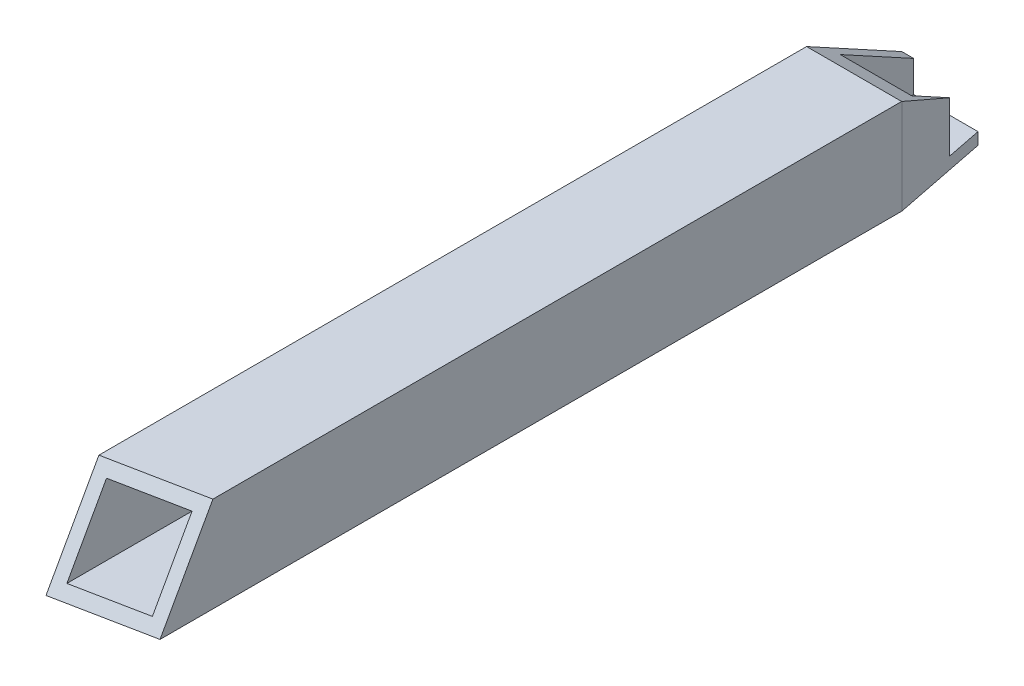
ISO-10303-21;
HEADER;
FILE_DESCRIPTION(('STEP AP214'),'2;1');
FILE_NAME('part.step','',(''),(''),'','','');
FILE_SCHEMA(('AUTOMOTIVE_DESIGN { 1 0 10303 214 1 1 1 1 }'));
ENDSEC;
DATA;
#1=APPLICATION_CONTEXT('core data for automotive mechanical design processes');
#2=APPLICATION_PROTOCOL_DEFINITION('international standard','automotive_design',2000,#1);
#3=PRODUCT_CONTEXT('',#1,'mechanical');
#4=PRODUCT('Part','Part','',(#3));
#5=PRODUCT_RELATED_PRODUCT_CATEGORY('part','',(#4));
#6=PRODUCT_DEFINITION_FORMATION('','',#4);
#7=PRODUCT_DEFINITION_CONTEXT('part definition',#1,'design');
#8=PRODUCT_DEFINITION('design','',#6,#7);
#9=PRODUCT_DEFINITION_SHAPE('','',#8);
#10=(LENGTH_UNIT() NAMED_UNIT(*) SI_UNIT(.MILLI.,.METRE.));
#11=(NAMED_UNIT(*) PLANE_ANGLE_UNIT() SI_UNIT($,.RADIAN.));
#12=(NAMED_UNIT(*) SI_UNIT($,.STERADIAN.) SOLID_ANGLE_UNIT());
#13=UNCERTAINTY_MEASURE_WITH_UNIT(LENGTH_MEASURE(1.E-05),#10,'distance_accuracy_value','');
#14=(GEOMETRIC_REPRESENTATION_CONTEXT(3) GLOBAL_UNCERTAINTY_ASSIGNED_CONTEXT((#13)) GLOBAL_UNIT_ASSIGNED_CONTEXT((#10,
#11,#12)) REPRESENTATION_CONTEXT('',''));
#15=CARTESIAN_POINT('',(0.,0.,0.));
#16=DIRECTION('',(0.,0.,1.));
#17=DIRECTION('',(1.,0.,0.));
#18=AXIS2_PLACEMENT_3D('',#15,#16,#17);
#19=CARTESIAN_POINT('',(12.7,-12.7,114.3));
#20=DIRECTION('',(-1.,0.,0.));
#21=DIRECTION('',(0.,0.,1.));
#22=AXIS2_PLACEMENT_3D('',#19,#20,#21);
#23=PLANE('',#22);
#24=DIRECTION('',(0.,-0.478845087585913,-0.877899414565723));
#25=VECTOR('',#24,1.);
#26=CARTESIAN_POINT('',(12.7,92.2774222970882,57.0406806060362));
#27=LINE('',#26,#25);
#28=CARTESIAN_POINT('',(12.7,12.7,-88.8540445533376));
#29=VERTEX_POINT('',#28);
#30=CARTESIAN_POINT('',(12.7,12.6749338711053,-88.9));
#31=VERTEX_POINT('',#30);
#32=EDGE_CURVE('E58',#29,#31,#27,.T.);
#33=ORIENTED_EDGE('',*,*,#32,.F.);
#34=DIRECTION('',(0.,0.,-1.));
#35=VECTOR('',#34,1.);
#36=CARTESIAN_POINT('',(12.7,12.7,114.3));
#37=LINE('',#36,#35);
#38=CARTESIAN_POINT('',(12.7,12.7,95.1168240755557));
#39=VERTEX_POINT('',#38);
#40=EDGE_CURVE('E216',#39,#29,#37,.T.);
#41=ORIENTED_EDGE('',*,*,#40,.F.);
#42=DIRECTION('',(0.,0.873936887721125,-0.486039418442901));
#43=VECTOR('',#42,1.);
#44=CARTESIAN_POINT('',(12.7,-14.8480433532563,110.437650051412));
#45=LINE('',#44,#43);
#46=CARTESIAN_POINT('',(12.7,-12.7,109.243017170164));
#47=VERTEX_POINT('',#46);
#48=EDGE_CURVE('E173',#47,#39,#45,.T.);
#49=ORIENTED_EDGE('',*,*,#48,.F.);
#50=DIRECTION('',(0.,0.,-1.));
#51=VECTOR('',#50,1.);
#52=CARTESIAN_POINT('',(12.7,-12.7,114.3));
#53=LINE('',#52,#51);
#54=CARTESIAN_POINT('',(12.7,-12.7,-88.9));
#55=VERTEX_POINT('',#54);
#56=EDGE_CURVE('E220',#47,#55,#53,.T.);
#57=ORIENTED_EDGE('',*,*,#56,.T.);
#58=DIRECTION('',(0.,-1.,0.));
#59=VECTOR('',#58,1.);
#60=CARTESIAN_POINT('',(12.7,-12.7,-88.9));
#61=LINE('',#60,#59);
#62=EDGE_CURVE('E64',#31,#55,#61,.T.);
#63=ORIENTED_EDGE('',*,*,#62,.F.);
#64=EDGE_LOOP('',(#33,#41,#49,#57,#63));
#65=FACE_BOUND('',#64,.T.);
#66=ADVANCED_FACE('F42',(#65),#23,.F.);
#67=CARTESIAN_POINT('',(12.7,12.7,114.3));
#68=DIRECTION('',(0.,-1.,0.));
#69=DIRECTION('',(0.,0.,-1.));
#70=AXIS2_PLACEMENT_3D('',#67,#68,#69);
#71=PLANE('',#70);
#72=DIRECTION('',(1.,0.,0.));
#73=VECTOR('',#72,1.);
#74=CARTESIAN_POINT('',(12.7,12.7,-88.8540445533377));
#75=LINE('',#74,#73);
#76=CARTESIAN_POINT('',(-12.7,12.7,-88.8540445533377));
#77=VERTEX_POINT('',#76);
#78=EDGE_CURVE('E256',#77,#29,#75,.T.);
#79=ORIENTED_EDGE('',*,*,#78,.F.);
#80=DIRECTION('',(0.,0.,-1.));
#81=VECTOR('',#80,1.);
#82=CARTESIAN_POINT('',(-12.7,12.7,114.3));
#83=LINE('',#82,#81);
#84=CARTESIAN_POINT('',(-12.7,12.7,100.173806905392));
#85=VERTEX_POINT('',#84);
#86=EDGE_CURVE('E212',#85,#77,#83,.T.);
#87=ORIENTED_EDGE('',*,*,#86,.F.);
#88=DIRECTION('',(-0.98075121578061,0.,0.195261498367845));
#89=VECTOR('',#88,1.);
#90=CARTESIAN_POINT('',(9.0263651832796,12.7,95.8482220358408));
#91=LINE('',#90,#89);
#92=EDGE_CURVE('E169',#39,#85,#91,.T.);
#93=ORIENTED_EDGE('',*,*,#92,.F.);
#94=ORIENTED_EDGE('',*,*,#40,.T.);
#95=EDGE_LOOP('',(#79,#87,#93,#94));
#96=FACE_BOUND('',#95,.T.);
#97=ADVANCED_FACE('F250',(#96),#71,.F.);
#98=CARTESIAN_POINT('',(9.525,-9.525,114.3));
#99=DIRECTION('',(-1.,0.,0.));
#100=DIRECTION('',(0.,0.,1.));
#101=AXIS2_PLACEMENT_3D('',#98,#99,#100);
#102=PLANE('',#101);
#103=DIRECTION('',(0.,0.,-1.));
#104=VECTOR('',#103,1.);
#105=CARTESIAN_POINT('',(9.525,9.525,114.3));
#106=LINE('',#105,#104);
#107=CARTESIAN_POINT('',(9.525,9.525,97.5147210661112));
#108=VERTEX_POINT('',#107);
#109=CARTESIAN_POINT('',(9.525,9.52500000000001,-94.6749889746294));
#110=VERTEX_POINT('',#109);
#111=EDGE_CURVE('E136',#108,#110,#106,.T.);
#112=ORIENTED_EDGE('',*,*,#111,.T.);
#113=DIRECTION('',(0.,-0.478845087585913,-0.877899414565723));
#114=VECTOR('',#113,1.);
#115=CARTESIAN_POINT('',(9.525,93.0054263589371,58.3753801910747));
#116=LINE('',#115,#114);
#117=CARTESIAN_POINT('',(9.52499999999999,3.97659657792253,-104.847256044493));
#118=VERTEX_POINT('',#117);
#119=EDGE_CURVE('E125',#110,#118,#116,.T.);
#120=ORIENTED_EDGE('',*,*,#119,.T.);
#121=DIRECTION('',(0.,-1.,0.));
#122=VECTOR('',#121,1.);
#123=CARTESIAN_POINT('',(9.525,-9.525,-104.847256044493));
#124=LINE('',#123,#122);
#125=CARTESIAN_POINT('',(9.525,-9.525,-104.847256044493));
#126=VERTEX_POINT('',#125);
#127=EDGE_CURVE('E132',#118,#126,#124,.T.);
#128=ORIENTED_EDGE('',*,*,#127,.T.);
#129=DIRECTION('',(0.,0.,-1.));
#130=VECTOR('',#129,1.);
#131=CARTESIAN_POINT('',(9.525,-9.525,114.3));
#132=LINE('',#131,#130);
#133=CARTESIAN_POINT('',(9.525,-9.525,108.109365887067));
#134=VERTEX_POINT('',#133);
#135=EDGE_CURVE('E205',#134,#126,#132,.T.);
#136=ORIENTED_EDGE('',*,*,#135,.F.);
#137=DIRECTION('',(0.,0.873936887721125,-0.486039418442901));
#138=VECTOR('',#137,1.);
#139=CARTESIAN_POINT('',(9.525,-12.1545818882893,109.571806104078));
#140=LINE('',#139,#138);
#141=EDGE_CURVE('E158',#134,#108,#140,.T.);
#142=ORIENTED_EDGE('',*,*,#141,.T.);
#143=EDGE_LOOP('',(#112,#120,#128,#136,#142));
#144=FACE_BOUND('',#143,.T.);
#145=ADVANCED_FACE('F130',(#144),#102,.T.);
#146=CARTESIAN_POINT('',(9.525,9.525,114.3));
#147=DIRECTION('',(0.,-1.,0.));
#148=DIRECTION('',(0.,0.,-1.));
#149=AXIS2_PLACEMENT_3D('',#146,#147,#148);
#150=PLANE('',#149);
#151=DIRECTION('',(0.,0.,-1.));
#152=VECTOR('',#151,1.);
#153=CARTESIAN_POINT('',(-9.52499999999999,9.525,114.3));
#154=LINE('',#153,#152);
#155=CARTESIAN_POINT('',(-9.52499999999999,9.525,101.307458188488));
#156=VERTEX_POINT('',#155);
#157=CARTESIAN_POINT('',(-9.52499999999999,9.525,-94.6749889746294));
#158=VERTEX_POINT('',#157);
#159=EDGE_CURVE('E199',#156,#158,#154,.T.);
#160=ORIENTED_EDGE('',*,*,#159,.T.);
#161=DIRECTION('',(1.,0.,0.));
#162=VECTOR('',#161,1.);
#163=CARTESIAN_POINT('',(9.525,9.525,-94.6749889746294));
#164=LINE('',#163,#162);
#165=EDGE_CURVE('E253',#158,#110,#164,.T.);
#166=ORIENTED_EDGE('',*,*,#165,.T.);
#167=ORIENTED_EDGE('',*,*,#111,.F.);
#168=DIRECTION('',(-0.98075121578061,0.,0.195261498367845));
#169=VECTOR('',#168,1.);
#170=CARTESIAN_POINT('',(6.31056953536965,9.525,98.1546942813607));
#171=LINE('',#170,#169);
#172=EDGE_CURVE('E228',#108,#156,#171,.T.);
#173=ORIENTED_EDGE('',*,*,#172,.T.);
#174=EDGE_LOOP('',(#160,#166,#167,#173));
#175=FACE_BOUND('',#174,.T.);
#176=ADVANCED_FACE('F274',(#175),#150,.T.);
#177=CARTESIAN_POINT('',(0.,0.,-114.3));
#178=DIRECTION('',(0.,0.,1.));
#179=DIRECTION('',(1.,0.,0.));
#180=AXIS2_PLACEMENT_3D('',#177,#178,#179);
#181=PLANE('',#180);
#182=DIRECTION('',(-1.,0.,0.));
#183=VECTOR('',#182,1.);
#184=CARTESIAN_POINT('',(0.,-1.1793471807835,-114.3));
#185=LINE('',#184,#183);
#186=CARTESIAN_POINT('',(-9.52499999999999,-1.17934718078351,-114.3));
#187=VERTEX_POINT('',#186);
#188=CARTESIAN_POINT('',(-12.7,-1.17934718078354,-114.3));
#189=VERTEX_POINT('',#188);
#190=EDGE_CURVE('E144',#187,#189,#185,.T.);
#191=ORIENTED_EDGE('',*,*,#190,.F.);
#192=DIRECTION('',(0.,-1.,0.));
#193=VECTOR('',#192,1.);
#194=CARTESIAN_POINT('',(-9.52499999999999,-9.525,-114.3));
#195=LINE('',#194,#193);
#196=CARTESIAN_POINT('',(-9.52499999999999,-9.525,-114.3));
#197=VERTEX_POINT('',#196);
#198=EDGE_CURVE('E185',#187,#197,#195,.T.);
#199=ORIENTED_EDGE('',*,*,#198,.T.);
#200=DIRECTION('',(1.,0.,0.));
#201=VECTOR('',#200,1.);
#202=CARTESIAN_POINT('',(9.525,-9.525,-114.3));
#203=LINE('',#202,#201);
#204=CARTESIAN_POINT('',(7.64301717016405,-9.525,-114.3));
#205=VERTEX_POINT('',#204);
#206=EDGE_CURVE('E188',#197,#205,#203,.T.);
#207=ORIENTED_EDGE('',*,*,#206,.T.);
#208=DIRECTION('',(0.,1.,0.));
#209=VECTOR('',#208,1.);
#210=CARTESIAN_POINT('',(7.64301717016405,0.,-114.3));
#211=LINE('',#210,#209);
#212=CARTESIAN_POINT('',(7.64301717016405,-12.7,-114.3));
#213=VERTEX_POINT('',#212);
#214=EDGE_CURVE('E51',#213,#205,#211,.T.);
#215=ORIENTED_EDGE('',*,*,#214,.F.);
#216=DIRECTION('',(1.,0.,0.));
#217=VECTOR('',#216,1.);
#218=CARTESIAN_POINT('',(12.7,-12.7,-114.3));
#219=LINE('',#218,#217);
#220=CARTESIAN_POINT('',(-12.7,-12.7,-114.3));
#221=VERTEX_POINT('',#220);
#222=EDGE_CURVE('E195',#221,#213,#219,.T.);
#223=ORIENTED_EDGE('',*,*,#222,.F.);
#224=DIRECTION('',(0.,-1.,0.));
#225=VECTOR('',#224,1.);
#226=CARTESIAN_POINT('',(-12.7,-12.7,-114.3));
#227=LINE('',#226,#225);
#228=EDGE_CURVE('E192',#189,#221,#227,.T.);
#229=ORIENTED_EDGE('',*,*,#228,.F.);
#230=EDGE_LOOP('',(#191,#199,#207,#215,#223,#229));
#231=FACE_BOUND('',#230,.T.);
#232=ADVANCED_FACE('F235',(#231),#181,.F.);
#233=CARTESIAN_POINT('',(-12.7,-12.7,114.3));
#234=DIRECTION('',(1.,0.,0.));
#235=DIRECTION('',(0.,0.,-1.));
#236=AXIS2_PLACEMENT_3D('',#233,#234,#235);
#237=PLANE('',#236);
#238=DIRECTION('',(0.,0.478845087585913,0.877899414565723));
#239=VECTOR('',#238,1.);
#240=CARTESIAN_POINT('',(-12.7,92.2774222970882,57.0406806060362));
#241=LINE('',#240,#239);
#242=EDGE_CURVE('E149',#189,#77,#241,.T.);
#243=ORIENTED_EDGE('',*,*,#242,.F.);
#244=ORIENTED_EDGE('',*,*,#228,.T.);
#245=DIRECTION('',(0.,0.,-1.));
#246=VECTOR('',#245,1.);
#247=CARTESIAN_POINT('',(-12.7,-12.7,114.3));
#248=LINE('',#247,#246);
#249=CARTESIAN_POINT('',(-12.7,-12.7,114.3));
#250=VERTEX_POINT('',#249);
#251=EDGE_CURVE('E224',#250,#221,#248,.T.);
#252=ORIENTED_EDGE('',*,*,#251,.F.);
#253=DIRECTION('',(0.,-0.873936887721125,0.486039418442901));
#254=VECTOR('',#253,1.);
#255=CARTESIAN_POINT('',(-12.7,-12.7,114.3));
#256=LINE('',#255,#254);
#257=EDGE_CURVE('E181',#85,#250,#256,.T.);
#258=ORIENTED_EDGE('',*,*,#257,.F.);
#259=ORIENTED_EDGE('',*,*,#86,.T.);
#260=EDGE_LOOP('',(#243,#244,#252,#258,#259));
#261=FACE_BOUND('',#260,.T.);
#262=ADVANCED_FACE('F44',(#261),#237,.F.);
#263=CARTESIAN_POINT('',(-9.52499999999999,-9.525,114.3));
#264=DIRECTION('',(1.,0.,0.));
#265=DIRECTION('',(0.,0.,-1.));
#266=AXIS2_PLACEMENT_3D('',#263,#264,#265);
#267=PLANE('',#266);
#268=ORIENTED_EDGE('',*,*,#198,.F.);
#269=DIRECTION('',(0.,0.478845087585913,0.877899414565723));
#270=VECTOR('',#269,1.);
#271=CARTESIAN_POINT('',(-9.52499999999999,93.0054263589371,58.3753801910747));
#272=LINE('',#271,#270);
#273=EDGE_CURVE('E261',#187,#158,#272,.T.);
#274=ORIENTED_EDGE('',*,*,#273,.T.);
#275=ORIENTED_EDGE('',*,*,#159,.F.);
#276=DIRECTION('',(0.,-0.873936887721125,0.486039418442901));
#277=VECTOR('',#276,1.);
#278=CARTESIAN_POINT('',(-9.52499999999999,-10.543549373347,112.468568565519));
#279=LINE('',#278,#277);
#280=CARTESIAN_POINT('',(-9.525,-9.525,111.902103009444));
#281=VERTEX_POINT('',#280);
#282=EDGE_CURVE('E165',#156,#281,#279,.T.);
#283=ORIENTED_EDGE('',*,*,#282,.T.);
#284=DIRECTION('',(0.,0.,-1.));
#285=VECTOR('',#284,1.);
#286=CARTESIAN_POINT('',(-9.52499999999999,-9.525,114.3));
#287=LINE('',#286,#285);
#288=EDGE_CURVE('E208',#281,#197,#287,.T.);
#289=ORIENTED_EDGE('',*,*,#288,.T.);
#290=EDGE_LOOP('',(#268,#274,#275,#283,#289));
#291=FACE_BOUND('',#290,.T.);
#292=ADVANCED_FACE('F267',(#291),#267,.T.);
#293=CARTESIAN_POINT('',(29.2403988557757,0.,-5.82158247839419));
#294=DIRECTION('',(0.98075121578061,0.,-0.195261498367845));
#295=DIRECTION('',(-0.195261498367845,0.,-0.98075121578061));
#296=AXIS2_PLACEMENT_3D('',#293,#294,#295);
#297=PLANE('',#296);
#298=ORIENTED_EDGE('',*,*,#127,.F.);
#299=DIRECTION('',(0.172174202287175,0.471694262890875,0.86478931909605));
#300=VECTOR('',#299,1.);
#301=CARTESIAN_POINT('',(24.5308581124395,45.0871525576523,-29.4764650251516));
#302=LINE('',#301,#300);
#303=EDGE_CURVE('E12',#118,#31,#302,.T.);
#304=ORIENTED_EDGE('',*,*,#303,.T.);
#305=ORIENTED_EDGE('',*,*,#62,.T.);
#306=DIRECTION('',(-0.195261498367845,0.,-0.98075121578061));
#307=VECTOR('',#306,1.);
#308=CARTESIAN_POINT('',(51.6133998300237,-12.7,106.552582882245));
#309=LINE('',#308,#307);
#310=EDGE_CURVE('E155',#55,#213,#309,.T.);
#311=ORIENTED_EDGE('',*,*,#310,.T.);
#312=ORIENTED_EDGE('',*,*,#214,.T.);
#313=DIRECTION('',(-0.195261498367845,0.,-0.98075121578061));
#314=VECTOR('',#313,1.);
#315=CARTESIAN_POINT('',(51.4923464375588,-9.525,105.944561009901));
#316=LINE('',#315,#314);
#317=EDGE_CURVE('E142',#126,#205,#316,.T.);
#318=ORIENTED_EDGE('',*,*,#317,.F.);
#319=EDGE_LOOP('',(#298,#304,#305,#311,#312,#318));
#320=FACE_BOUND('',#319,.T.);
#321=ADVANCED_FACE('F140',(#320),#297,.T.);
#322=CARTESIAN_POINT('',(12.7,-12.7,114.3));
#323=DIRECTION('',(0.,1.,0.));
#324=DIRECTION('',(0.,0.,1.));
#325=AXIS2_PLACEMENT_3D('',#322,#323,#324);
#326=PLANE('',#325);
#327=ORIENTED_EDGE('',*,*,#310,.F.);
#328=ORIENTED_EDGE('',*,*,#56,.F.);
#329=DIRECTION('',(0.98075121578061,0.,-0.195261498367845));
#330=VECTOR('',#329,1.);
#331=CARTESIAN_POINT('',(11.7315728602807,-12.7,109.435825021247));
#332=LINE('',#331,#330);
#333=EDGE_CURVE('E177',#250,#47,#332,.T.);
#334=ORIENTED_EDGE('',*,*,#333,.F.);
#335=ORIENTED_EDGE('',*,*,#251,.T.);
#336=ORIENTED_EDGE('',*,*,#222,.T.);
#337=EDGE_LOOP('',(#327,#328,#334,#335,#336));
#338=FACE_BOUND('',#337,.T.);
#339=ADVANCED_FACE('F239',(#338),#326,.F.);
#340=CARTESIAN_POINT('',(9.525,-9.525,114.3));
#341=DIRECTION('',(0.,1.,0.));
#342=DIRECTION('',(0.,0.,1.));
#343=AXIS2_PLACEMENT_3D('',#340,#341,#342);
#344=PLANE('',#343);
#345=ORIENTED_EDGE('',*,*,#135,.T.);
#346=ORIENTED_EDGE('',*,*,#317,.T.);
#347=ORIENTED_EDGE('',*,*,#206,.F.);
#348=ORIENTED_EDGE('',*,*,#288,.F.);
#349=DIRECTION('',(0.98075121578061,0.,-0.195261498367845));
#350=VECTOR('',#349,1.);
#351=CARTESIAN_POINT('',(8.33947529312044,-9.525,108.345396520415));
#352=LINE('',#351,#350);
#353=EDGE_CURVE('E161',#281,#134,#352,.T.);
#354=ORIENTED_EDGE('',*,*,#353,.T.);
#355=EDGE_LOOP('',(#345,#346,#347,#348,#354));
#356=FACE_BOUND('',#355,.T.);
#357=ADVANCED_FACE('F271',(#356),#344,.T.);
#358=CARTESIAN_POINT('',(15.4542013014831,43.1698186554413,77.6227102733519));
#359=DIRECTION('',(0.171419955104357,0.478845087585913,0.861000918168419));
#360=DIRECTION('',(0.,-0.873936887721125,0.486039418442901));
#361=AXIS2_PLACEMENT_3D('',#358,#359,#360);
#362=PLANE('',#361);
#363=ORIENTED_EDGE('',*,*,#282,.F.);
#364=ORIENTED_EDGE('',*,*,#172,.F.);
#365=ORIENTED_EDGE('',*,*,#141,.F.);
#366=ORIENTED_EDGE('',*,*,#353,.F.);
#367=EDGE_LOOP('',(#363,#364,#365,#366));
#368=FACE_BOUND('',#367,.T.);
#369=ORIENTED_EDGE('',*,*,#92,.T.);
#370=ORIENTED_EDGE('',*,*,#257,.T.);
#371=ORIENTED_EDGE('',*,*,#333,.T.);
#372=ORIENTED_EDGE('',*,*,#48,.T.);
#373=EDGE_LOOP('',(#369,#370,#371,#372));
#374=FACE_BOUND('',#373,.T.);
#375=ADVANCED_FACE('F246',(#368,#374),#362,.T.);
#376=CARTESIAN_POINT('',(0.,47.1402534831006,-25.7123748272502));
#377=DIRECTION('',(0.,0.877899414565723,-0.478845087585913));
#378=DIRECTION('',(0.,0.478845087585913,0.877899414565723));
#379=AXIS2_PLACEMENT_3D('',#376,#377,#378);
#380=PLANE('',#379);
#381=ORIENTED_EDGE('',*,*,#273,.F.);
#382=ORIENTED_EDGE('',*,*,#190,.T.);
#383=ORIENTED_EDGE('',*,*,#242,.T.);
#384=ORIENTED_EDGE('',*,*,#78,.T.);
#385=ORIENTED_EDGE('',*,*,#32,.T.);
#386=ORIENTED_EDGE('',*,*,#303,.F.);
#387=ORIENTED_EDGE('',*,*,#119,.F.);
#388=ORIENTED_EDGE('',*,*,#165,.F.);
#389=EDGE_LOOP('',(#381,#382,#383,#384,#385,#386,#387,#388));
#390=FACE_BOUND('',#389,.T.);
#391=ADVANCED_FACE('F124',(#390),#380,.T.);
#392=CLOSED_SHELL('',(#66,#97,#145,#176,#232,#262,#292,#321,#339,#357,#375,#391));
#393=MANIFOLD_SOLID_BREP('B2',#392);
#394=ADVANCED_BREP_SHAPE_REPRESENTATION('',(#18,#393),#14);
#395=SHAPE_DEFINITION_REPRESENTATION(#9,#394);
ENDSEC;
END-ISO-10303-21;
